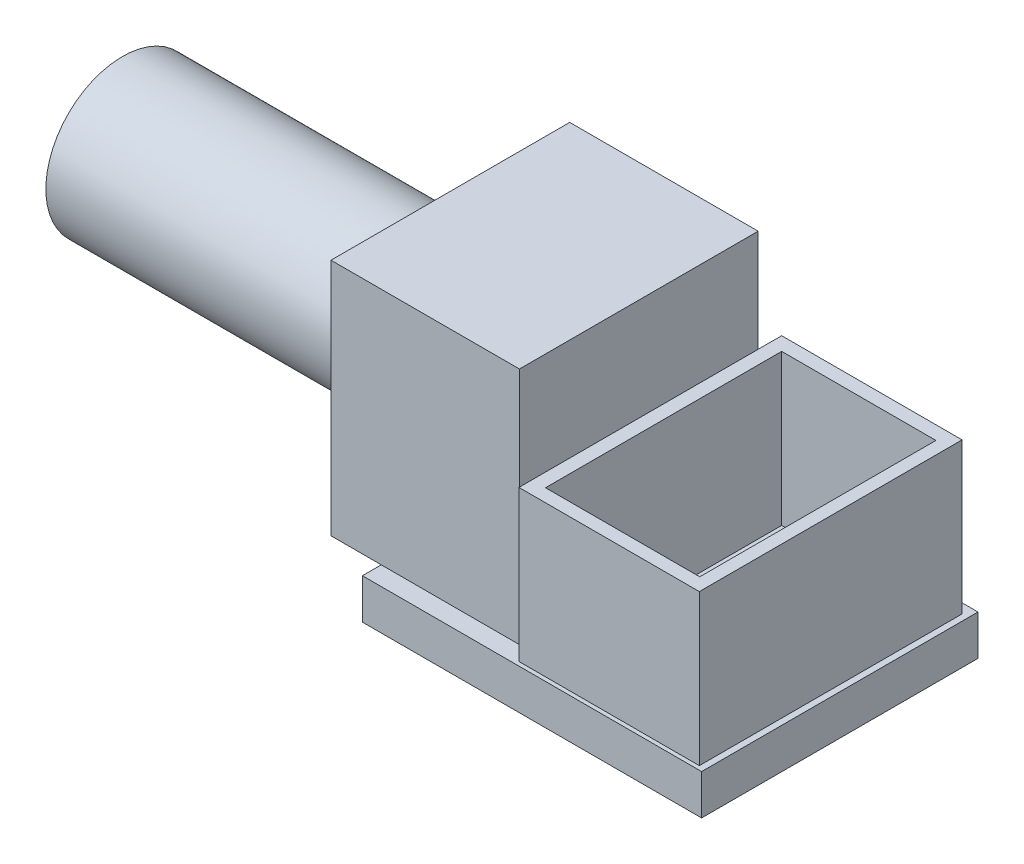
ISO-10303-21;
HEADER;
FILE_DESCRIPTION(('STEP AP214'),'2;1');
FILE_NAME('part.step','',(''),(''),'','','');
FILE_SCHEMA(('AUTOMOTIVE_DESIGN { 1 0 10303 214 1 1 1 1 }'));
ENDSEC;
DATA;
#1=APPLICATION_CONTEXT('core data for automotive mechanical design processes');
#2=APPLICATION_PROTOCOL_DEFINITION('international standard','automotive_design',2000,#1);
#3=PRODUCT_CONTEXT('',#1,'mechanical');
#4=PRODUCT('Part','Part','',(#3));
#5=PRODUCT_RELATED_PRODUCT_CATEGORY('part','',(#4));
#6=PRODUCT_DEFINITION_FORMATION('','',#4);
#7=PRODUCT_DEFINITION_CONTEXT('part definition',#1,'design');
#8=PRODUCT_DEFINITION('design','',#6,#7);
#9=PRODUCT_DEFINITION_SHAPE('','',#8);
#10=(LENGTH_UNIT() NAMED_UNIT(*) SI_UNIT(.MILLI.,.METRE.));
#11=(NAMED_UNIT(*) PLANE_ANGLE_UNIT() SI_UNIT($,.RADIAN.));
#12=(NAMED_UNIT(*) SI_UNIT($,.STERADIAN.) SOLID_ANGLE_UNIT());
#13=UNCERTAINTY_MEASURE_WITH_UNIT(LENGTH_MEASURE(1.E-05),#10,'distance_accuracy_value','');
#14=(GEOMETRIC_REPRESENTATION_CONTEXT(3) GLOBAL_UNCERTAINTY_ASSIGNED_CONTEXT((#13)) GLOBAL_UNIT_ASSIGNED_CONTEXT((#10,
#11,#12)) REPRESENTATION_CONTEXT('',''));
#15=CARTESIAN_POINT('',(0.,0.,0.));
#16=DIRECTION('',(0.,0.,1.));
#17=DIRECTION('',(1.,0.,0.));
#18=AXIS2_PLACEMENT_3D('',#15,#16,#17);
#19=CARTESIAN_POINT('',(0.,1.6,0.));
#20=DIRECTION('',(0.,1.,0.));
#21=DIRECTION('',(0.,0.,1.));
#22=AXIS2_PLACEMENT_3D('',#19,#20,#21);
#23=PLANE('',#22);
#24=DIRECTION('',(-1.,0.,0.));
#25=VECTOR('',#24,1.);
#26=CARTESIAN_POINT('',(-15.0891028693892,1.6,-4.79845814977973));
#27=LINE('',#26,#25);
#28=CARTESIAN_POINT('',(-7.58910286938921,1.6,-4.79845814977973));
#29=VERTEX_POINT('',#28);
#30=CARTESIAN_POINT('',(-13.0891028693892,1.6,-4.79845814977973));
#31=VERTEX_POINT('',#30);
#32=EDGE_CURVE('E227',#29,#31,#27,.T.);
#33=ORIENTED_EDGE('',*,*,#32,.F.);
#34=DIRECTION('',(0.,0.,-1.));
#35=VECTOR('',#34,1.);
#36=CARTESIAN_POINT('',(-7.58910286938921,1.6,-4.79845814977973));
#37=LINE('',#36,#35);
#38=CARTESIAN_POINT('',(-7.58910286938921,1.6,4.70154185022027));
#39=VERTEX_POINT('',#38);
#40=EDGE_CURVE('E239',#39,#29,#37,.T.);
#41=ORIENTED_EDGE('',*,*,#40,.F.);
#42=DIRECTION('',(1.,0.,0.));
#43=VECTOR('',#42,1.);
#44=CARTESIAN_POINT('',(-15.0891028693892,1.6,4.70154185022027));
#45=LINE('',#44,#43);
#46=CARTESIAN_POINT('',(-13.0891028693892,1.6,4.70154185022027));
#47=VERTEX_POINT('',#46);
#48=EDGE_CURVE('E42',#47,#39,#45,.T.);
#49=ORIENTED_EDGE('',*,*,#48,.F.);
#50=DIRECTION('',(0.,0.,1.));
#51=VECTOR('',#50,1.);
#52=CARTESIAN_POINT('',(-13.0891028693892,1.6,-5.54845814977973));
#53=LINE('',#52,#51);
#54=CARTESIAN_POINT('',(-13.0891028693892,1.6,5.45154185022027));
#55=VERTEX_POINT('',#54);
#56=EDGE_CURVE('E262',#47,#55,#53,.T.);
#57=ORIENTED_EDGE('',*,*,#56,.T.);
#58=DIRECTION('',(1.,0.,0.));
#59=VECTOR('',#58,1.);
#60=CARTESIAN_POINT('',(-13.0891028693892,1.6,5.45154185022027));
#61=LINE('',#60,#59);
#62=CARTESIAN_POINT('',(0.41089713061079,1.6,5.45154185022027));
#63=VERTEX_POINT('',#62);
#64=EDGE_CURVE('E260',#55,#63,#61,.T.);
#65=ORIENTED_EDGE('',*,*,#64,.T.);
#66=DIRECTION('',(0.,0.,-1.));
#67=VECTOR('',#66,1.);
#68=CARTESIAN_POINT('',(0.41089713061079,1.6,-5.54845814977973));
#69=LINE('',#68,#67);
#70=CARTESIAN_POINT('',(0.41089713061079,1.6,-5.54845814977973));
#71=VERTEX_POINT('',#70);
#72=EDGE_CURVE('E264',#63,#71,#69,.T.);
#73=ORIENTED_EDGE('',*,*,#72,.T.);
#74=DIRECTION('',(-1.,0.,0.));
#75=VECTOR('',#74,1.);
#76=CARTESIAN_POINT('',(-13.0891028693892,1.6,-5.54845814977973));
#77=LINE('',#76,#75);
#78=CARTESIAN_POINT('',(-13.0891028693892,1.6,-5.54845814977973));
#79=VERTEX_POINT('',#78);
#80=EDGE_CURVE('E266',#71,#79,#77,.T.);
#81=ORIENTED_EDGE('',*,*,#80,.T.);
#82=EDGE_CURVE('E257',#79,#31,#53,.T.);
#83=ORIENTED_EDGE('',*,*,#82,.T.);
#84=EDGE_LOOP('',(#33,#41,#49,#57,#65,#73,#81,#83));
#85=FACE_BOUND('',#84,.T.);
#86=DIRECTION('',(0.,0.,1.));
#87=VECTOR('',#86,1.);
#88=CARTESIAN_POINT('',(0.161957780949962,1.6,-5.16463122079358));
#89=LINE('',#88,#87);
#90=CARTESIAN_POINT('',(0.161957780949962,1.6,-5.16463122079358));
#91=VERTEX_POINT('',#90);
#92=CARTESIAN_POINT('',(0.161957780949962,1.6,5.29368729496582));
#93=VERTEX_POINT('',#92);
#94=EDGE_CURVE('E209',#91,#93,#89,.T.);
#95=ORIENTED_EDGE('',*,*,#94,.T.);
#96=DIRECTION('',(1.,0.,0.));
#97=VECTOR('',#96,1.);
#98=CARTESIAN_POINT('',(-7.01832804327829,1.6,5.29368729496582));
#99=LINE('',#98,#97);
#100=CARTESIAN_POINT('',(-7.01832804327829,1.6,5.29368729496582));
#101=VERTEX_POINT('',#100);
#102=EDGE_CURVE('E191',#101,#93,#99,.T.);
#103=ORIENTED_EDGE('',*,*,#102,.F.);
#104=DIRECTION('',(0.,0.,1.));
#105=VECTOR('',#104,1.);
#106=CARTESIAN_POINT('',(-7.01832804327829,1.6,-5.16463122079358));
#107=LINE('',#106,#105);
#108=CARTESIAN_POINT('',(-7.01832804327829,1.6,-5.16463122079358));
#109=VERTEX_POINT('',#108);
#110=EDGE_CURVE('E198',#109,#101,#107,.T.);
#111=ORIENTED_EDGE('',*,*,#110,.F.);
#112=DIRECTION('',(1.,0.,0.));
#113=VECTOR('',#112,1.);
#114=CARTESIAN_POINT('',(-7.01832804327829,1.6,-5.16463122079358));
#115=LINE('',#114,#113);
#116=EDGE_CURVE('E58',#109,#91,#115,.T.);
#117=ORIENTED_EDGE('',*,*,#116,.T.);
#118=EDGE_LOOP('',(#95,#103,#111,#117));
#119=FACE_BOUND('',#118,.T.);
#120=ADVANCED_FACE('F33',(#85,#119),#23,.T.);
#121=CARTESIAN_POINT('',(-13.0891028693892,1.6,-5.54845814977973));
#122=DIRECTION('',(1.,0.,0.));
#123=DIRECTION('',(0.,0.,-1.));
#124=AXIS2_PLACEMENT_3D('',#121,#122,#123);
#125=PLANE('',#124);
#126=DIRECTION('',(0.,0.,1.));
#127=VECTOR('',#126,1.);
#128=CARTESIAN_POINT('',(-13.0891028693892,0.,-5.54845814977973));
#129=LINE('',#128,#127);
#130=CARTESIAN_POINT('',(-13.0891028693892,0.,-5.54845814977973));
#131=VERTEX_POINT('',#130);
#132=CARTESIAN_POINT('',(-13.0891028693892,0.,5.45154185022027));
#133=VERTEX_POINT('',#132);
#134=EDGE_CURVE('E256',#131,#133,#129,.T.);
#135=ORIENTED_EDGE('',*,*,#134,.T.);
#136=DIRECTION('',(0.,-1.,0.));
#137=VECTOR('',#136,1.);
#138=CARTESIAN_POINT('',(-13.0891028693892,1.6,5.45154185022027));
#139=LINE('',#138,#137);
#140=EDGE_CURVE('E37',#55,#133,#139,.T.);
#141=ORIENTED_EDGE('',*,*,#140,.F.);
#142=ORIENTED_EDGE('',*,*,#56,.F.);
#143=EDGE_CURVE('E261',#31,#47,#53,.T.);
#144=ORIENTED_EDGE('',*,*,#143,.F.);
#145=ORIENTED_EDGE('',*,*,#82,.F.);
#146=DIRECTION('',(0.,-1.,0.));
#147=VECTOR('',#146,1.);
#148=CARTESIAN_POINT('',(-13.0891028693892,1.6,-5.54845814977973));
#149=LINE('',#148,#147);
#150=EDGE_CURVE('E268',#79,#131,#149,.T.);
#151=ORIENTED_EDGE('',*,*,#150,.T.);
#152=EDGE_LOOP('',(#135,#141,#142,#144,#145,#151));
#153=FACE_BOUND('',#152,.T.);
#154=ADVANCED_FACE('F35',(#153),#125,.F.);
#155=CARTESIAN_POINT('',(-13.0891028693892,1.6,5.45154185022027));
#156=DIRECTION('',(0.,0.,-1.));
#157=DIRECTION('',(-1.,0.,0.));
#158=AXIS2_PLACEMENT_3D('',#155,#156,#157);
#159=PLANE('',#158);
#160=DIRECTION('',(1.,0.,0.));
#161=VECTOR('',#160,1.);
#162=CARTESIAN_POINT('',(-13.0891028693892,0.,5.45154185022027));
#163=LINE('',#162,#161);
#164=CARTESIAN_POINT('',(0.41089713061079,0.,5.45154185022027));
#165=VERTEX_POINT('',#164);
#166=EDGE_CURVE('E271',#133,#165,#163,.T.);
#167=ORIENTED_EDGE('',*,*,#166,.T.);
#168=DIRECTION('',(0.,-1.,0.));
#169=VECTOR('',#168,1.);
#170=CARTESIAN_POINT('',(0.41089713061079,1.6,5.45154185022027));
#171=LINE('',#170,#169);
#172=EDGE_CURVE('E281',#63,#165,#171,.T.);
#173=ORIENTED_EDGE('',*,*,#172,.F.);
#174=ORIENTED_EDGE('',*,*,#64,.F.);
#175=ORIENTED_EDGE('',*,*,#140,.T.);
#176=EDGE_LOOP('',(#167,#173,#174,#175));
#177=FACE_BOUND('',#176,.T.);
#178=ADVANCED_FACE('F317',(#177),#159,.F.);
#179=CARTESIAN_POINT('',(0.41089713061079,1.6,-5.54845814977973));
#180=DIRECTION('',(-1.,0.,0.));
#181=DIRECTION('',(0.,0.,1.));
#182=AXIS2_PLACEMENT_3D('',#179,#180,#181);
#183=PLANE('',#182);
#184=DIRECTION('',(0.,0.,-1.));
#185=VECTOR('',#184,1.);
#186=CARTESIAN_POINT('',(0.41089713061079,0.,-5.54845814977973));
#187=LINE('',#186,#185);
#188=CARTESIAN_POINT('',(0.41089713061079,0.,-5.54845814977973));
#189=VERTEX_POINT('',#188);
#190=EDGE_CURVE('E273',#165,#189,#187,.T.);
#191=ORIENTED_EDGE('',*,*,#190,.T.);
#192=DIRECTION('',(0.,-1.,0.));
#193=VECTOR('',#192,1.);
#194=CARTESIAN_POINT('',(0.41089713061079,1.6,-5.54845814977973));
#195=LINE('',#194,#193);
#196=EDGE_CURVE('E279',#71,#189,#195,.T.);
#197=ORIENTED_EDGE('',*,*,#196,.F.);
#198=ORIENTED_EDGE('',*,*,#72,.F.);
#199=ORIENTED_EDGE('',*,*,#172,.T.);
#200=EDGE_LOOP('',(#191,#197,#198,#199));
#201=FACE_BOUND('',#200,.T.);
#202=ADVANCED_FACE('F324',(#201),#183,.F.);
#203=CARTESIAN_POINT('',(-13.0891028693892,1.6,-5.54845814977973));
#204=DIRECTION('',(0.,0.,1.));
#205=DIRECTION('',(1.,0.,0.));
#206=AXIS2_PLACEMENT_3D('',#203,#204,#205);
#207=PLANE('',#206);
#208=DIRECTION('',(-1.,0.,0.));
#209=VECTOR('',#208,1.);
#210=CARTESIAN_POINT('',(-13.0891028693892,0.,-5.54845814977973));
#211=LINE('',#210,#209);
#212=EDGE_CURVE('E275',#189,#131,#211,.T.);
#213=ORIENTED_EDGE('',*,*,#212,.T.);
#214=ORIENTED_EDGE('',*,*,#150,.F.);
#215=ORIENTED_EDGE('',*,*,#80,.F.);
#216=ORIENTED_EDGE('',*,*,#196,.T.);
#217=EDGE_LOOP('',(#213,#214,#215,#216));
#218=FACE_BOUND('',#217,.T.);
#219=ADVANCED_FACE('F327',(#218),#207,.F.);
#220=CARTESIAN_POINT('',(0.,0.,0.));
#221=DIRECTION('',(0.,1.,0.));
#222=DIRECTION('',(0.,0.,1.));
#223=AXIS2_PLACEMENT_3D('',#220,#221,#222);
#224=PLANE('',#223);
#225=ORIENTED_EDGE('',*,*,#134,.F.);
#226=ORIENTED_EDGE('',*,*,#212,.F.);
#227=ORIENTED_EDGE('',*,*,#190,.F.);
#228=ORIENTED_EDGE('',*,*,#166,.F.);
#229=EDGE_LOOP('',(#225,#226,#227,#228));
#230=FACE_BOUND('',#229,.T.);
#231=ADVANCED_FACE('F322',(#230),#224,.F.);
#232=CARTESIAN_POINT('',(0.,1.6,0.));
#233=DIRECTION('',(0.,1.,0.));
#234=DIRECTION('',(0.,0.,1.));
#235=AXIS2_PLACEMENT_3D('',#232,#233,#234);
#236=PLANE('',#235);
#237=CARTESIAN_POINT('',(-15.0891028693892,1.6,-4.79845814977973));
#238=VERTEX_POINT('',#237);
#239=EDGE_CURVE('E242',#31,#238,#27,.T.);
#240=ORIENTED_EDGE('',*,*,#239,.F.);
#241=ORIENTED_EDGE('',*,*,#143,.T.);
#242=CARTESIAN_POINT('',(-15.0891028693892,1.6,4.70154185022027));
#243=VERTEX_POINT('',#242);
#244=EDGE_CURVE('E236',#243,#47,#45,.T.);
#245=ORIENTED_EDGE('',*,*,#244,.F.);
#246=DIRECTION('',(0.,0.,1.));
#247=VECTOR('',#246,1.);
#248=CARTESIAN_POINT('',(-15.0891028693892,1.6,-4.79845814977973));
#249=LINE('',#248,#247);
#250=EDGE_CURVE('E222',#238,#243,#249,.T.);
#251=ORIENTED_EDGE('',*,*,#250,.F.);
#252=EDGE_LOOP('',(#240,#241,#245,#251));
#253=FACE_BOUND('',#252,.T.);
#254=ADVANCED_FACE('F312',(#253),#236,.F.);
#255=CARTESIAN_POINT('',(-15.0891028693892,11.1,-4.79845814977973));
#256=DIRECTION('',(1.,0.,0.));
#257=DIRECTION('',(0.,0.,-1.));
#258=AXIS2_PLACEMENT_3D('',#255,#256,#257);
#259=PLANE('',#258);
#260=CARTESIAN_POINT('',(-15.0891028693892,6.22125594528455,0.));
#261=DIRECTION('',(-1.,0.,0.));
#262=DIRECTION('',(0.,0.,1.));
#263=AXIS2_PLACEMENT_3D('',#260,#261,#262);
#264=CIRCLE('',#263,3.05);
#265=CARTESIAN_POINT('',(-15.0891028693892,6.22125594528455,-3.05));
#266=VERTEX_POINT('',#265);
#267=EDGE_CURVE('E11',#266,#266,#264,.T.);
#268=ORIENTED_EDGE('',*,*,#267,.F.);
#269=EDGE_LOOP('',(#268));
#270=FACE_BOUND('',#269,.T.);
#271=ORIENTED_EDGE('',*,*,#250,.T.);
#272=DIRECTION('',(0.,-1.,0.));
#273=VECTOR('',#272,1.);
#274=CARTESIAN_POINT('',(-15.0891028693892,11.1,4.70154185022027));
#275=LINE('',#274,#273);
#276=CARTESIAN_POINT('',(-15.0891028693892,11.1,4.70154185022027));
#277=VERTEX_POINT('',#276);
#278=EDGE_CURVE('E253',#277,#243,#275,.T.);
#279=ORIENTED_EDGE('',*,*,#278,.F.);
#280=DIRECTION('',(0.,0.,1.));
#281=VECTOR('',#280,1.);
#282=CARTESIAN_POINT('',(-15.0891028693892,11.1,-4.79845814977973));
#283=LINE('',#282,#281);
#284=CARTESIAN_POINT('',(-15.0891028693892,11.1,-4.79845814977973));
#285=VERTEX_POINT('',#284);
#286=EDGE_CURVE('E223',#285,#277,#283,.T.);
#287=ORIENTED_EDGE('',*,*,#286,.F.);
#288=DIRECTION('',(0.,-1.,0.));
#289=VECTOR('',#288,1.);
#290=CARTESIAN_POINT('',(-15.0891028693892,11.1,-4.79845814977973));
#291=LINE('',#290,#289);
#292=EDGE_CURVE('E233',#285,#238,#291,.T.);
#293=ORIENTED_EDGE('',*,*,#292,.T.);
#294=EDGE_LOOP('',(#271,#279,#287,#293));
#295=FACE_BOUND('',#294,.T.);
#296=ADVANCED_FACE('F309',(#270,#295),#259,.F.);
#297=CARTESIAN_POINT('',(-15.0891028693892,11.1,4.70154185022027));
#298=DIRECTION('',(0.,0.,-1.));
#299=DIRECTION('',(-1.,0.,0.));
#300=AXIS2_PLACEMENT_3D('',#297,#298,#299);
#301=PLANE('',#300);
#302=ORIENTED_EDGE('',*,*,#244,.T.);
#303=ORIENTED_EDGE('',*,*,#48,.T.);
#304=DIRECTION('',(0.,-1.,0.));
#305=VECTOR('',#304,1.);
#306=CARTESIAN_POINT('',(-7.58910286938921,11.1,4.70154185022027));
#307=LINE('',#306,#305);
#308=CARTESIAN_POINT('',(-7.58910286938921,11.1,4.70154185022027));
#309=VERTEX_POINT('',#308);
#310=EDGE_CURVE('E250',#309,#39,#307,.T.);
#311=ORIENTED_EDGE('',*,*,#310,.F.);
#312=DIRECTION('',(1.,0.,0.));
#313=VECTOR('',#312,1.);
#314=CARTESIAN_POINT('',(-15.0891028693892,11.1,4.70154185022027));
#315=LINE('',#314,#313);
#316=EDGE_CURVE('E226',#277,#309,#315,.T.);
#317=ORIENTED_EDGE('',*,*,#316,.F.);
#318=ORIENTED_EDGE('',*,*,#278,.T.);
#319=EDGE_LOOP('',(#302,#303,#311,#317,#318));
#320=FACE_BOUND('',#319,.T.);
#321=ADVANCED_FACE('F294',(#320),#301,.F.);
#322=CARTESIAN_POINT('',(-7.58910286938921,11.1,-4.79845814977973));
#323=DIRECTION('',(-1.,0.,0.));
#324=DIRECTION('',(0.,0.,1.));
#325=AXIS2_PLACEMENT_3D('',#322,#323,#324);
#326=PLANE('',#325);
#327=ORIENTED_EDGE('',*,*,#40,.T.);
#328=DIRECTION('',(0.,-1.,0.));
#329=VECTOR('',#328,1.);
#330=CARTESIAN_POINT('',(-7.58910286938921,11.1,-4.79845814977973));
#331=LINE('',#330,#329);
#332=CARTESIAN_POINT('',(-7.58910286938921,11.1,-4.79845814977973));
#333=VERTEX_POINT('',#332);
#334=EDGE_CURVE('E247',#333,#29,#331,.T.);
#335=ORIENTED_EDGE('',*,*,#334,.F.);
#336=DIRECTION('',(0.,0.,-1.));
#337=VECTOR('',#336,1.);
#338=CARTESIAN_POINT('',(-7.58910286938921,11.1,-4.79845814977973));
#339=LINE('',#338,#337);
#340=EDGE_CURVE('E229',#309,#333,#339,.T.);
#341=ORIENTED_EDGE('',*,*,#340,.F.);
#342=ORIENTED_EDGE('',*,*,#310,.T.);
#343=EDGE_LOOP('',(#327,#335,#341,#342));
#344=FACE_BOUND('',#343,.T.);
#345=ADVANCED_FACE('F299',(#344),#326,.F.);
#346=CARTESIAN_POINT('',(-15.0891028693892,11.1,-4.79845814977973));
#347=DIRECTION('',(0.,0.,1.));
#348=DIRECTION('',(1.,0.,0.));
#349=AXIS2_PLACEMENT_3D('',#346,#347,#348);
#350=PLANE('',#349);
#351=ORIENTED_EDGE('',*,*,#32,.T.);
#352=ORIENTED_EDGE('',*,*,#239,.T.);
#353=ORIENTED_EDGE('',*,*,#292,.F.);
#354=DIRECTION('',(-1.,0.,0.));
#355=VECTOR('',#354,1.);
#356=CARTESIAN_POINT('',(-15.0891028693892,11.1,-4.79845814977973));
#357=LINE('',#356,#355);
#358=EDGE_CURVE('E231',#333,#285,#357,.T.);
#359=ORIENTED_EDGE('',*,*,#358,.F.);
#360=ORIENTED_EDGE('',*,*,#334,.T.);
#361=EDGE_LOOP('',(#351,#352,#353,#359,#360));
#362=FACE_BOUND('',#361,.T.);
#363=ADVANCED_FACE('F329',(#362),#350,.F.);
#364=CARTESIAN_POINT('',(0.,11.1,0.));
#365=DIRECTION('',(0.,1.,0.));
#366=DIRECTION('',(0.,0.,1.));
#367=AXIS2_PLACEMENT_3D('',#364,#365,#366);
#368=PLANE('',#367);
#369=ORIENTED_EDGE('',*,*,#286,.T.);
#370=ORIENTED_EDGE('',*,*,#316,.T.);
#371=ORIENTED_EDGE('',*,*,#340,.T.);
#372=ORIENTED_EDGE('',*,*,#358,.T.);
#373=EDGE_LOOP('',(#369,#370,#371,#372));
#374=FACE_BOUND('',#373,.T.);
#375=ADVANCED_FACE('F303',(#374),#368,.T.);
#376=CARTESIAN_POINT('',(-7.01832804327829,7.6,5.29368729496582));
#377=DIRECTION('',(0.,0.,-1.));
#378=DIRECTION('',(-1.,0.,0.));
#379=AXIS2_PLACEMENT_3D('',#376,#377,#378);
#380=PLANE('',#379);
#381=ORIENTED_EDGE('',*,*,#102,.T.);
#382=DIRECTION('',(0.,-1.,0.));
#383=VECTOR('',#382,1.);
#384=CARTESIAN_POINT('',(0.161957780949962,7.6,5.29368729496582));
#385=LINE('',#384,#383);
#386=CARTESIAN_POINT('',(0.161957780949962,7.6,5.29368729496582));
#387=VERTEX_POINT('',#386);
#388=EDGE_CURVE('E220',#387,#93,#385,.T.);
#389=ORIENTED_EDGE('',*,*,#388,.F.);
#390=DIRECTION('',(1.,0.,0.));
#391=VECTOR('',#390,1.);
#392=CARTESIAN_POINT('',(-7.01832804327829,7.6,5.29368729496582));
#393=LINE('',#392,#391);
#394=CARTESIAN_POINT('',(-7.01832804327829,7.6,5.29368729496582));
#395=VERTEX_POINT('',#394);
#396=EDGE_CURVE('E195',#395,#387,#393,.T.);
#397=ORIENTED_EDGE('',*,*,#396,.F.);
#398=DIRECTION('',(0.,-1.,0.));
#399=VECTOR('',#398,1.);
#400=CARTESIAN_POINT('',(-7.01832804327829,7.6,5.29368729496582));
#401=LINE('',#400,#399);
#402=EDGE_CURVE('E206',#395,#101,#401,.T.);
#403=ORIENTED_EDGE('',*,*,#402,.T.);
#404=EDGE_LOOP('',(#381,#389,#397,#403));
#405=FACE_BOUND('',#404,.T.);
#406=ADVANCED_FACE('F336',(#405),#380,.F.);
#407=CARTESIAN_POINT('',(0.161957780949962,7.6,-5.16463122079358));
#408=DIRECTION('',(1.,0.,0.));
#409=DIRECTION('',(0.,0.,-1.));
#410=AXIS2_PLACEMENT_3D('',#407,#408,#409);
#411=PLANE('',#410);
#412=ORIENTED_EDGE('',*,*,#94,.F.);
#413=DIRECTION('',(0.,-1.,0.));
#414=VECTOR('',#413,1.);
#415=CARTESIAN_POINT('',(0.161957780949962,7.6,-5.16463122079358));
#416=LINE('',#415,#414);
#417=CARTESIAN_POINT('',(0.161957780949962,7.6,-5.16463122079358));
#418=VERTEX_POINT('',#417);
#419=EDGE_CURVE('E218',#418,#91,#416,.T.);
#420=ORIENTED_EDGE('',*,*,#419,.F.);
#421=DIRECTION('',(0.,0.,1.));
#422=VECTOR('',#421,1.);
#423=CARTESIAN_POINT('',(0.161957780949962,7.6,-5.16463122079358));
#424=LINE('',#423,#422);
#425=EDGE_CURVE('E197',#418,#387,#424,.T.);
#426=ORIENTED_EDGE('',*,*,#425,.T.);
#427=ORIENTED_EDGE('',*,*,#388,.T.);
#428=EDGE_LOOP('',(#412,#420,#426,#427));
#429=FACE_BOUND('',#428,.T.);
#430=ADVANCED_FACE('F415',(#429),#411,.T.);
#431=CARTESIAN_POINT('',(-7.01832804327829,7.6,-5.16463122079358));
#432=DIRECTION('',(0.,0.,-1.));
#433=DIRECTION('',(-1.,0.,0.));
#434=AXIS2_PLACEMENT_3D('',#431,#432,#433);
#435=PLANE('',#434);
#436=ORIENTED_EDGE('',*,*,#116,.F.);
#437=DIRECTION('',(0.,-1.,0.));
#438=VECTOR('',#437,1.);
#439=CARTESIAN_POINT('',(-7.01832804327829,7.6,-5.16463122079358));
#440=LINE('',#439,#438);
#441=CARTESIAN_POINT('',(-7.01832804327829,7.6,-5.16463122079358));
#442=VERTEX_POINT('',#441);
#443=EDGE_CURVE('E216',#442,#109,#440,.T.);
#444=ORIENTED_EDGE('',*,*,#443,.F.);
#445=DIRECTION('',(1.,0.,0.));
#446=VECTOR('',#445,1.);
#447=CARTESIAN_POINT('',(-7.01832804327829,7.6,-5.16463122079358));
#448=LINE('',#447,#446);
#449=EDGE_CURVE('E201',#442,#418,#448,.T.);
#450=ORIENTED_EDGE('',*,*,#449,.T.);
#451=ORIENTED_EDGE('',*,*,#419,.T.);
#452=EDGE_LOOP('',(#436,#444,#450,#451));
#453=FACE_BOUND('',#452,.T.);
#454=ADVANCED_FACE('F425',(#453),#435,.T.);
#455=CARTESIAN_POINT('',(-7.01832804327829,7.6,-5.16463122079358));
#456=DIRECTION('',(1.,0.,0.));
#457=DIRECTION('',(0.,0.,-1.));
#458=AXIS2_PLACEMENT_3D('',#455,#456,#457);
#459=PLANE('',#458);
#460=ORIENTED_EDGE('',*,*,#110,.T.);
#461=ORIENTED_EDGE('',*,*,#402,.F.);
#462=DIRECTION('',(0.,0.,1.));
#463=VECTOR('',#462,1.);
#464=CARTESIAN_POINT('',(-7.01832804327829,7.6,-5.16463122079358));
#465=LINE('',#464,#463);
#466=EDGE_CURVE('E204',#442,#395,#465,.T.);
#467=ORIENTED_EDGE('',*,*,#466,.F.);
#468=ORIENTED_EDGE('',*,*,#443,.T.);
#469=EDGE_LOOP('',(#460,#461,#467,#468));
#470=FACE_BOUND('',#469,.T.);
#471=ADVANCED_FACE('F435',(#470),#459,.F.);
#472=CARTESIAN_POINT('',(0.,7.6,0.));
#473=DIRECTION('',(0.,-1.,0.));
#474=DIRECTION('',(0.,0.,-1.));
#475=AXIS2_PLACEMENT_3D('',#472,#473,#474);
#476=PLANE('',#475);
#477=DIRECTION('',(1.,0.,0.));
#478=VECTOR('',#477,1.);
#479=CARTESIAN_POINT('',(-6.47821073296484,7.6,4.77602177011249));
#480=LINE('',#479,#478);
#481=CARTESIAN_POINT('',(-6.47821073296484,7.6,4.77602177011249));
#482=VERTEX_POINT('',#481);
#483=CARTESIAN_POINT('',(-0.33890654191282,7.6,4.77602177011249));
#484=VERTEX_POINT('',#483);
#485=EDGE_CURVE('E184',#482,#484,#480,.T.);
#486=ORIENTED_EDGE('',*,*,#485,.F.);
#487=DIRECTION('',(0.,0.,1.));
#488=VECTOR('',#487,1.);
#489=CARTESIAN_POINT('',(-6.47821073296484,7.6,-4.62423826820668));
#490=LINE('',#489,#488);
#491=CARTESIAN_POINT('',(-6.47821073296484,7.6,-4.62423826820668));
#492=VERTEX_POINT('',#491);
#493=EDGE_CURVE('E50',#492,#482,#490,.T.);
#494=ORIENTED_EDGE('',*,*,#493,.F.);
#495=DIRECTION('',(-1.,0.,0.));
#496=VECTOR('',#495,1.);
#497=CARTESIAN_POINT('',(-6.47821073296484,7.6,-4.62423826820668));
#498=LINE('',#497,#496);
#499=CARTESIAN_POINT('',(-0.33890654191282,7.6,-4.62423826820668));
#500=VERTEX_POINT('',#499);
#501=EDGE_CURVE('E174',#500,#492,#498,.T.);
#502=ORIENTED_EDGE('',*,*,#501,.F.);
#503=DIRECTION('',(0.,0.,-1.));
#504=VECTOR('',#503,1.);
#505=CARTESIAN_POINT('',(-0.33890654191282,7.6,-4.62423826820668));
#506=LINE('',#505,#504);
#507=EDGE_CURVE('E177',#484,#500,#506,.T.);
#508=ORIENTED_EDGE('',*,*,#507,.F.);
#509=EDGE_LOOP('',(#486,#494,#502,#508));
#510=FACE_BOUND('',#509,.T.);
#511=ORIENTED_EDGE('',*,*,#396,.T.);
#512=ORIENTED_EDGE('',*,*,#425,.F.);
#513=ORIENTED_EDGE('',*,*,#449,.F.);
#514=ORIENTED_EDGE('',*,*,#466,.T.);
#515=EDGE_LOOP('',(#511,#512,#513,#514));
#516=FACE_BOUND('',#515,.T.);
#517=ADVANCED_FACE('F444',(#510,#516),#476,.F.);
#518=CARTESIAN_POINT('',(-6.47821073296484,1.6,-4.62423826820668));
#519=DIRECTION('',(-1.,0.,0.));
#520=DIRECTION('',(0.,0.,1.));
#521=AXIS2_PLACEMENT_3D('',#518,#519,#520);
#522=PLANE('',#521);
#523=ORIENTED_EDGE('',*,*,#493,.T.);
#524=DIRECTION('',(0.,1.,0.));
#525=VECTOR('',#524,1.);
#526=CARTESIAN_POINT('',(-6.47821073296484,1.6,4.77602177011249));
#527=LINE('',#526,#525);
#528=CARTESIAN_POINT('',(-6.47821073296484,1.6,4.77602177011249));
#529=VERTEX_POINT('',#528);
#530=EDGE_CURVE('E152',#529,#482,#527,.T.);
#531=ORIENTED_EDGE('',*,*,#530,.F.);
#532=DIRECTION('',(0.,0.,1.));
#533=VECTOR('',#532,1.);
#534=CARTESIAN_POINT('',(-6.47821073296484,1.6,-4.62423826820668));
#535=LINE('',#534,#533);
#536=CARTESIAN_POINT('',(-6.47821073296484,1.6,-4.62423826820668));
#537=VERTEX_POINT('',#536);
#538=EDGE_CURVE('E156',#537,#529,#535,.T.);
#539=ORIENTED_EDGE('',*,*,#538,.F.);
#540=DIRECTION('',(0.,1.,0.));
#541=VECTOR('',#540,1.);
#542=CARTESIAN_POINT('',(-6.47821073296484,1.6,-4.62423826820668));
#543=LINE('',#542,#541);
#544=EDGE_CURVE('E189',#537,#492,#543,.T.);
#545=ORIENTED_EDGE('',*,*,#544,.T.);
#546=EDGE_LOOP('',(#523,#531,#539,#545));
#547=FACE_BOUND('',#546,.T.);
#548=ADVANCED_FACE('F154',(#547),#522,.F.);
#549=CARTESIAN_POINT('',(-6.47821073296484,1.6,-4.62423826820668));
#550=DIRECTION('',(0.,0.,-1.));
#551=DIRECTION('',(-1.,0.,0.));
#552=AXIS2_PLACEMENT_3D('',#549,#550,#551);
#553=PLANE('',#552);
#554=ORIENTED_EDGE('',*,*,#501,.T.);
#555=ORIENTED_EDGE('',*,*,#544,.F.);
#556=DIRECTION('',(-1.,0.,0.));
#557=VECTOR('',#556,1.);
#558=CARTESIAN_POINT('',(-6.47821073296484,1.6,-4.62423826820668));
#559=LINE('',#558,#557);
#560=CARTESIAN_POINT('',(-0.33890654191282,1.6,-4.62423826820668));
#561=VERTEX_POINT('',#560);
#562=EDGE_CURVE('E162',#561,#537,#559,.T.);
#563=ORIENTED_EDGE('',*,*,#562,.F.);
#564=DIRECTION('',(0.,1.,0.));
#565=VECTOR('',#564,1.);
#566=CARTESIAN_POINT('',(-0.33890654191282,1.6,-4.62423826820668));
#567=LINE('',#566,#565);
#568=EDGE_CURVE('E192',#561,#500,#567,.T.);
#569=ORIENTED_EDGE('',*,*,#568,.T.);
#570=EDGE_LOOP('',(#554,#555,#563,#569));
#571=FACE_BOUND('',#570,.T.);
#572=ADVANCED_FACE('F463',(#571),#553,.F.);
#573=CARTESIAN_POINT('',(-0.33890654191282,1.6,-4.62423826820668));
#574=DIRECTION('',(1.,0.,0.));
#575=DIRECTION('',(0.,0.,-1.));
#576=AXIS2_PLACEMENT_3D('',#573,#574,#575);
#577=PLANE('',#576);
#578=ORIENTED_EDGE('',*,*,#507,.T.);
#579=ORIENTED_EDGE('',*,*,#568,.F.);
#580=DIRECTION('',(0.,0.,-1.));
#581=VECTOR('',#580,1.);
#582=CARTESIAN_POINT('',(-0.33890654191282,1.6,-4.62423826820668));
#583=LINE('',#582,#581);
#584=CARTESIAN_POINT('',(-0.33890654191282,1.6,4.77602177011249));
#585=VERTEX_POINT('',#584);
#586=EDGE_CURVE('E170',#585,#561,#583,.T.);
#587=ORIENTED_EDGE('',*,*,#586,.F.);
#588=DIRECTION('',(0.,1.,0.));
#589=VECTOR('',#588,1.);
#590=CARTESIAN_POINT('',(-0.33890654191282,1.6,4.77602177011249));
#591=LINE('',#590,#589);
#592=EDGE_CURVE('E161',#585,#484,#591,.T.);
#593=ORIENTED_EDGE('',*,*,#592,.T.);
#594=EDGE_LOOP('',(#578,#579,#587,#593));
#595=FACE_BOUND('',#594,.T.);
#596=ADVANCED_FACE('F472',(#595),#577,.F.);
#597=CARTESIAN_POINT('',(-6.47821073296484,1.6,4.77602177011249));
#598=DIRECTION('',(0.,0.,1.));
#599=DIRECTION('',(1.,0.,0.));
#600=AXIS2_PLACEMENT_3D('',#597,#598,#599);
#601=PLANE('',#600);
#602=ORIENTED_EDGE('',*,*,#485,.T.);
#603=ORIENTED_EDGE('',*,*,#592,.F.);
#604=DIRECTION('',(1.,0.,0.));
#605=VECTOR('',#604,1.);
#606=CARTESIAN_POINT('',(-6.47821073296484,1.6,4.77602177011249));
#607=LINE('',#606,#605);
#608=EDGE_CURVE('E165',#529,#585,#607,.T.);
#609=ORIENTED_EDGE('',*,*,#608,.F.);
#610=ORIENTED_EDGE('',*,*,#530,.T.);
#611=EDGE_LOOP('',(#602,#603,#609,#610));
#612=FACE_BOUND('',#611,.T.);
#613=ADVANCED_FACE('F166',(#612),#601,.F.);
#614=CARTESIAN_POINT('',(0.,1.6,0.));
#615=DIRECTION('',(0.,1.,0.));
#616=DIRECTION('',(0.,0.,1.));
#617=AXIS2_PLACEMENT_3D('',#614,#615,#616);
#618=PLANE('',#617);
#619=ORIENTED_EDGE('',*,*,#538,.T.);
#620=ORIENTED_EDGE('',*,*,#608,.T.);
#621=ORIENTED_EDGE('',*,*,#586,.T.);
#622=ORIENTED_EDGE('',*,*,#562,.T.);
#623=EDGE_LOOP('',(#619,#620,#621,#622));
#624=FACE_BOUND('',#623,.T.);
#625=ADVANCED_FACE('F172',(#624),#618,.T.);
#626=CARTESIAN_POINT('',(-28.0891028693892,6.22125594528455,0.));
#627=DIRECTION('',(1.,0.,0.));
#628=DIRECTION('',(0.,0.,-1.));
#629=AXIS2_PLACEMENT_3D('',#626,#627,#628);
#630=CYLINDRICAL_SURFACE('',#629,3.05);
#631=CARTESIAN_POINT('',(-28.0891028693892,6.22125594528455,0.));
#632=DIRECTION('',(-1.,0.,0.));
#633=DIRECTION('',(0.,0.,1.));
#634=AXIS2_PLACEMENT_3D('',#631,#632,#633);
#635=CIRCLE('',#634,3.05);
#636=CARTESIAN_POINT('',(-28.0891028693892,6.22125594528455,-3.05));
#637=VERTEX_POINT('',#636);
#638=EDGE_CURVE('E185',#637,#637,#635,.T.);
#639=CARTESIAN_POINT('',(-28.0891028693892,6.22125594528455,-3.05));
#640=CARTESIAN_POINT('',(-27.9536862027225,6.22125594528455,-3.05));
#641=CARTESIAN_POINT('',(-27.8182695360559,6.22125594528455,-3.05));
#642=CARTESIAN_POINT('',(-27.5474362027225,6.22125594528455,-3.05));
#643=CARTESIAN_POINT('',(-27.4120195360559,6.22125594528455,-3.05));
#644=CARTESIAN_POINT('',(-27.1411862027225,6.22125594528455,-3.05));
#645=CARTESIAN_POINT('',(-27.0057695360559,6.22125594528455,-3.05));
#646=CARTESIAN_POINT('',(-26.7349362027225,6.22125594528455,-3.05));
#647=CARTESIAN_POINT('',(-26.5995195360559,6.22125594528455,-3.05));
#648=CARTESIAN_POINT('',(-26.3286862027225,6.22125594528455,-3.05));
#649=CARTESIAN_POINT('',(-26.1932695360559,6.22125594528455,-3.05));
#650=CARTESIAN_POINT('',(-25.9224362027225,6.22125594528455,-3.05));
#651=CARTESIAN_POINT('',(-25.7870195360559,6.22125594528455,-3.05));
#652=CARTESIAN_POINT('',(-25.5161862027225,6.22125594528455,-3.05));
#653=CARTESIAN_POINT('',(-25.3807695360559,6.22125594528455,-3.05));
#654=CARTESIAN_POINT('',(-25.1099362027225,6.22125594528455,-3.05));
#655=CARTESIAN_POINT('',(-24.9745195360559,6.22125594528455,-3.05));
#656=CARTESIAN_POINT('',(-24.7036862027225,6.22125594528455,-3.05));
#657=CARTESIAN_POINT('',(-24.5682695360559,6.22125594528455,-3.05));
#658=CARTESIAN_POINT('',(-24.2974362027225,6.22125594528455,-3.05));
#659=CARTESIAN_POINT('',(-24.1620195360559,6.22125594528455,-3.05));
#660=CARTESIAN_POINT('',(-23.8911862027225,6.22125594528455,-3.05));
#661=CARTESIAN_POINT('',(-23.7557695360559,6.22125594528455,-3.05));
#662=CARTESIAN_POINT('',(-23.4849362027225,6.22125594528455,-3.05));
#663=CARTESIAN_POINT('',(-23.3495195360559,6.22125594528455,-3.05));
#664=CARTESIAN_POINT('',(-23.0786862027225,6.22125594528455,-3.05));
#665=CARTESIAN_POINT('',(-22.9432695360559,6.22125594528455,-3.05));
#666=CARTESIAN_POINT('',(-22.6724362027225,6.22125594528455,-3.05));
#667=CARTESIAN_POINT('',(-22.5370195360559,6.22125594528455,-3.05));
#668=CARTESIAN_POINT('',(-22.2661862027225,6.22125594528455,-3.05));
#669=CARTESIAN_POINT('',(-22.1307695360559,6.22125594528455,-3.05));
#670=CARTESIAN_POINT('',(-21.8599362027225,6.22125594528455,-3.05));
#671=CARTESIAN_POINT('',(-21.7245195360559,6.22125594528455,-3.05));
#672=CARTESIAN_POINT('',(-21.4536862027225,6.22125594528455,-3.05));
#673=CARTESIAN_POINT('',(-21.3182695360559,6.22125594528455,-3.05));
#674=CARTESIAN_POINT('',(-21.0474362027225,6.22125594528455,-3.05));
#675=CARTESIAN_POINT('',(-20.9120195360559,6.22125594528455,-3.05));
#676=CARTESIAN_POINT('',(-20.6411862027225,6.22125594528455,-3.05));
#677=CARTESIAN_POINT('',(-20.5057695360559,6.22125594528455,-3.05));
#678=CARTESIAN_POINT('',(-20.2349362027225,6.22125594528455,-3.05));
#679=CARTESIAN_POINT('',(-20.0995195360559,6.22125594528455,-3.05));
#680=CARTESIAN_POINT('',(-19.8286862027225,6.22125594528455,-3.05));
#681=CARTESIAN_POINT('',(-19.6932695360559,6.22125594528455,-3.05));
#682=CARTESIAN_POINT('',(-19.4224362027225,6.22125594528455,-3.05));
#683=CARTESIAN_POINT('',(-19.2870195360559,6.22125594528455,-3.05));
#684=CARTESIAN_POINT('',(-19.0161862027225,6.22125594528455,-3.05));
#685=CARTESIAN_POINT('',(-18.8807695360559,6.22125594528455,-3.05));
#686=CARTESIAN_POINT('',(-18.6099362027225,6.22125594528455,-3.05));
#687=CARTESIAN_POINT('',(-18.4745195360559,6.22125594528455,-3.05));
#688=CARTESIAN_POINT('',(-18.2036862027225,6.22125594528455,-3.05));
#689=CARTESIAN_POINT('',(-18.0682695360559,6.22125594528455,-3.05));
#690=CARTESIAN_POINT('',(-17.7974362027225,6.22125594528455,-3.05));
#691=CARTESIAN_POINT('',(-17.6620195360559,6.22125594528455,-3.05));
#692=CARTESIAN_POINT('',(-17.3911862027225,6.22125594528455,-3.05));
#693=CARTESIAN_POINT('',(-17.2557695360559,6.22125594528455,-3.05));
#694=CARTESIAN_POINT('',(-16.9849362027225,6.22125594528455,-3.05));
#695=CARTESIAN_POINT('',(-16.8495195360559,6.22125594528455,-3.05));
#696=CARTESIAN_POINT('',(-16.5786862027225,6.22125594528455,-3.05));
#697=CARTESIAN_POINT('',(-16.4432695360559,6.22125594528455,-3.05));
#698=CARTESIAN_POINT('',(-16.1724362027225,6.22125594528455,-3.05));
#699=CARTESIAN_POINT('',(-16.0370195360559,6.22125594528455,-3.05));
#700=CARTESIAN_POINT('',(-15.7661862027225,6.22125594528455,-3.05));
#701=CARTESIAN_POINT('',(-15.6307695360559,6.22125594528455,-3.05));
#702=CARTESIAN_POINT('',(-15.3599362027225,6.22125594528455,-3.05));
#703=CARTESIAN_POINT('',(-15.2245195360559,6.22125594528455,-3.05));
#704=CARTESIAN_POINT('',(-15.0891028693892,6.22125594528455,-3.05));
#705=B_SPLINE_CURVE_WITH_KNOTS('',3,(#639,#640,#641,#642,#643,#644,#645,#646,#647,#648,#649,
#650,#651,#652,#653,#654,#655,#656,#657,#658,#659,#660,#661,#662,#663,#664,#665,#666,#667,#668,
#669,#670,#671,#672,#673,#674,#675,#676,#677,#678,#679,#680,#681,#682,#683,#684,#685,#686,#687,
#688,#689,#690,#691,#692,#693,#694,#695,#696,#697,#698,#699,#700,#701,#702,#703,#704),
.UNSPECIFIED.,.F.,.F.,(4,2,2,2,2,2,2,2,2,2,2,2,2,2,2,2,2,2,2,2,2,2,2,2,2,2,2,2,2,2,2,2,4),(0.,
0.40625,0.812500000000001,1.21875,1.625,2.03125,2.4375,2.84375,3.25,3.65625,4.0625,4.46875,
4.875,5.28125,5.6875,6.09375,6.5,6.90625,7.3125,7.71875,8.125,8.53125,8.9375,9.34375,9.75,
10.15625,10.5625,10.96875,11.375,11.78125,12.1875,12.59375,13.),.UNSPECIFIED.);
#706=EDGE_CURVE('BSEAM497',#637,#266,#705,.T.);
#707=ORIENTED_EDGE('',*,*,#638,.F.);
#708=ORIENTED_EDGE('',*,*,#267,.T.);
#709=ORIENTED_EDGE('',*,*,#706,.T.);
#710=ORIENTED_EDGE('',*,*,#706,.F.);
#711=EDGE_LOOP('',(#707,#709,#708,#710));
#712=FACE_BOUND('',#711,.T.);
#713=ADVANCED_FACE('F497',(#712),#630,.T.);
#714=CARTESIAN_POINT('',(-28.0891028693892,6.22125594528455,0.));
#715=DIRECTION('',(-1.,0.,0.));
#716=DIRECTION('',(0.,0.,1.));
#717=AXIS2_PLACEMENT_3D('',#714,#715,#716);
#718=PLANE('',#717);
#719=ORIENTED_EDGE('',*,*,#638,.T.);
#720=EDGE_LOOP('',(#719));
#721=FACE_BOUND('',#720,.T.);
#722=ADVANCED_FACE('F506',(#721),#718,.T.);
#723=CLOSED_SHELL('',(#120,#154,#178,#202,#219,#231,#254,#296,#321,#345,#363,#375,#406,#430,
#454,#471,#517,#548,#572,#596,#613,#625,#713,#722));
#724=MANIFOLD_SOLID_BREP('B2',#723);
#725=ADVANCED_BREP_SHAPE_REPRESENTATION('',(#18,#724),#14);
#726=SHAPE_DEFINITION_REPRESENTATION(#9,#725);
ENDSEC;
END-ISO-10303-21;
